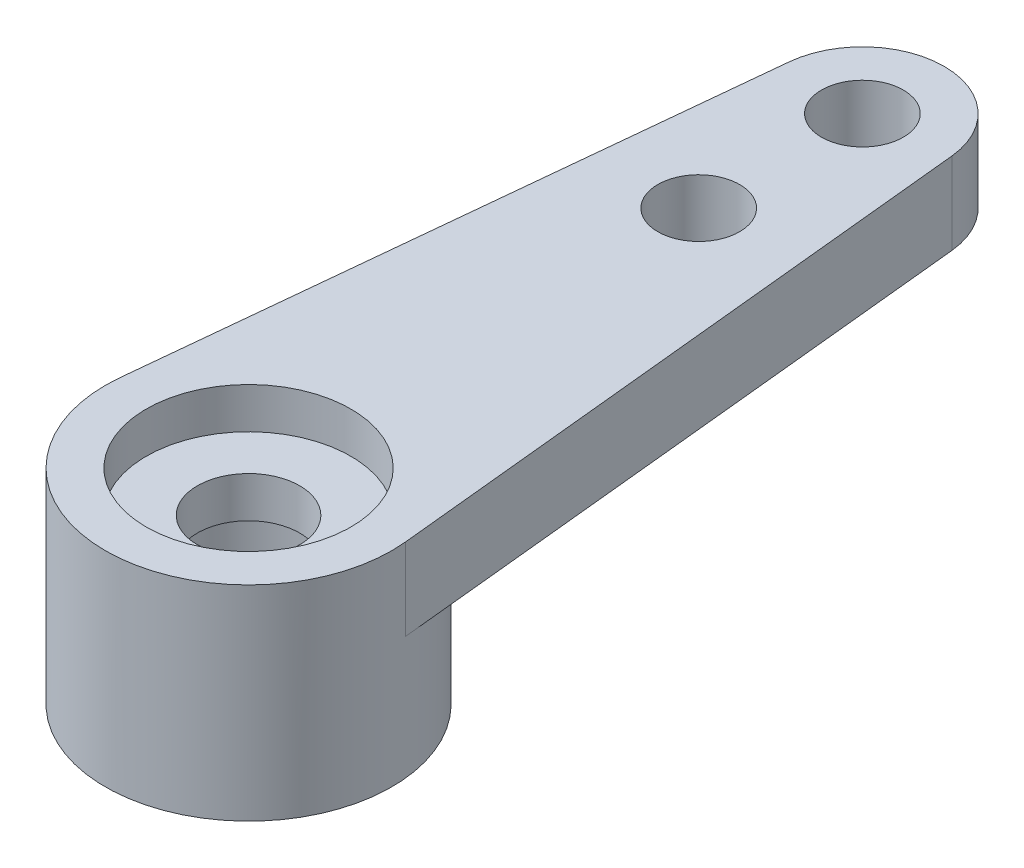
ISO-10303-21;
HEADER;
FILE_DESCRIPTION(('STEP AP214'),'2;1');
FILE_NAME('part.step','',(''),(''),'','','');
FILE_SCHEMA(('AUTOMOTIVE_DESIGN { 1 0 10303 214 1 1 1 1 }'));
ENDSEC;
DATA;
#1=APPLICATION_CONTEXT('core data for automotive mechanical design processes');
#2=APPLICATION_PROTOCOL_DEFINITION('international standard','automotive_design',2000,#1);
#3=PRODUCT_CONTEXT('',#1,'mechanical');
#4=PRODUCT('Part','Part','',(#3));
#5=PRODUCT_RELATED_PRODUCT_CATEGORY('part','',(#4));
#6=PRODUCT_DEFINITION_FORMATION('','',#4);
#7=PRODUCT_DEFINITION_CONTEXT('part definition',#1,'design');
#8=PRODUCT_DEFINITION('design','',#6,#7);
#9=PRODUCT_DEFINITION_SHAPE('','',#8);
#10=(LENGTH_UNIT() NAMED_UNIT(*) SI_UNIT(.MILLI.,.METRE.));
#11=(NAMED_UNIT(*) PLANE_ANGLE_UNIT() SI_UNIT($,.RADIAN.));
#12=(NAMED_UNIT(*) SI_UNIT($,.STERADIAN.) SOLID_ANGLE_UNIT());
#13=UNCERTAINTY_MEASURE_WITH_UNIT(LENGTH_MEASURE(1.E-05),#10,'distance_accuracy_value','');
#14=(GEOMETRIC_REPRESENTATION_CONTEXT(3) GLOBAL_UNCERTAINTY_ASSIGNED_CONTEXT((#13)) GLOBAL_UNIT_ASSIGNED_CONTEXT((#10,
#11,#12)) REPRESENTATION_CONTEXT('',''));
#15=CARTESIAN_POINT('',(0.,0.,0.));
#16=DIRECTION('',(0.,0.,1.));
#17=DIRECTION('',(1.,0.,0.));
#18=AXIS2_PLACEMENT_3D('',#15,#16,#17);
#19=CARTESIAN_POINT('',(0.,2.,0.));
#20=DIRECTION('',(0.,-1.,0.));
#21=DIRECTION('',(0.,0.,-1.));
#22=AXIS2_PLACEMENT_3D('',#19,#20,#21);
#23=CYLINDRICAL_SURFACE('',#22,1.25);
#24=CARTESIAN_POINT('',(0.,0.,0.));
#25=DIRECTION('',(0.,1.,0.));
#26=DIRECTION('',(0.,0.,1.));
#27=AXIS2_PLACEMENT_3D('',#24,#25,#26);
#28=CIRCLE('',#27,1.25);
#29=CARTESIAN_POINT('',(0.,0.,1.25));
#30=VERTEX_POINT('',#29);
#31=EDGE_CURVE('E130',#30,#30,#28,.T.);
#32=ORIENTED_EDGE('',*,*,#31,.F.);
#33=EDGE_LOOP('',(#32));
#34=FACE_BOUND('',#33,.T.);
#35=CARTESIAN_POINT('',(0.,1.,0.));
#36=DIRECTION('',(0.,1.,0.));
#37=DIRECTION('',(0.,0.,1.));
#38=AXIS2_PLACEMENT_3D('',#35,#36,#37);
#39=CIRCLE('',#38,1.25);
#40=CARTESIAN_POINT('',(0.,1.,1.25));
#41=VERTEX_POINT('',#40);
#42=EDGE_CURVE('E45',#41,#41,#39,.T.);
#43=ORIENTED_EDGE('',*,*,#42,.T.);
#44=EDGE_LOOP('',(#43));
#45=FACE_BOUND('',#44,.T.);
#46=ADVANCED_FACE('F41',(#34,#45),#23,.F.);
#47=CARTESIAN_POINT('',(0.,0.,0.));
#48=DIRECTION('',(0.,1.,0.));
#49=DIRECTION('',(0.,0.,1.));
#50=AXIS2_PLACEMENT_3D('',#47,#48,#49);
#51=PLANE('',#50);
#52=ORIENTED_EDGE('',*,*,#31,.T.);
#53=EDGE_LOOP('',(#52));
#54=FACE_BOUND('',#53,.T.);
#55=CARTESIAN_POINT('',(0.,0.,0.));
#56=DIRECTION('',(0.,-1.,0.));
#57=DIRECTION('',(0.,0.,-1.));
#58=AXIS2_PLACEMENT_3D('',#55,#56,#57);
#59=CIRCLE('',#58,2.);
#60=CARTESIAN_POINT('',(0.,0.,-2.));
#61=VERTEX_POINT('',#60);
#62=EDGE_CURVE('E139',#61,#61,#59,.T.);
#63=ORIENTED_EDGE('',*,*,#62,.T.);
#64=EDGE_LOOP('',(#63));
#65=FACE_BOUND('',#64,.T.);
#66=ADVANCED_FACE('F166',(#54,#65),#51,.F.);
#67=CARTESIAN_POINT('',(0.,2.,0.));
#68=DIRECTION('',(0.,1.,0.));
#69=DIRECTION('',(0.,0.,1.));
#70=AXIS2_PLACEMENT_3D('',#67,#68,#69);
#71=PLANE('',#70);
#72=CARTESIAN_POINT('',(0.,2.,0.));
#73=DIRECTION('',(0.,1.,0.));
#74=DIRECTION('',(0.,0.,1.));
#75=AXIS2_PLACEMENT_3D('',#72,#73,#74);
#76=CIRCLE('',#75,2.5);
#77=CARTESIAN_POINT('',(0.,2.,2.5));
#78=VERTEX_POINT('',#77);
#79=EDGE_CURVE('E144',#78,#78,#76,.T.);
#80=ORIENTED_EDGE('',*,*,#79,.F.);
#81=EDGE_LOOP('',(#80));
#82=FACE_BOUND('',#81,.T.);
#83=CARTESIAN_POINT('',(0.,2.,-11.));
#84=DIRECTION('',(0.,1.,0.));
#85=DIRECTION('',(0.,0.,1.));
#86=AXIS2_PLACEMENT_3D('',#83,#84,#85);
#87=CIRCLE('',#86,1.);
#88=CARTESIAN_POINT('',(0.,2.,-10.));
#89=VERTEX_POINT('',#88);
#90=EDGE_CURVE('E124',#89,#89,#87,.T.);
#91=ORIENTED_EDGE('',*,*,#90,.F.);
#92=EDGE_LOOP('',(#91));
#93=FACE_BOUND('',#92,.T.);
#94=CARTESIAN_POINT('',(0.,2.,0.));
#95=DIRECTION('',(0.,1.,0.));
#96=DIRECTION('',(0.,0.,1.));
#97=AXIS2_PLACEMENT_3D('',#94,#95,#96);
#98=CIRCLE('',#97,3.5);
#99=CARTESIAN_POINT('',(-3.48245602987317,2.,-0.349999999999999));
#100=VERTEX_POINT('',#99);
#101=CARTESIAN_POINT('',(3.48245602987317,2.,-0.35));
#102=VERTEX_POINT('',#101);
#103=EDGE_CURVE('E104',#100,#102,#98,.T.);
#104=ORIENTED_EDGE('',*,*,#103,.T.);
#105=DIRECTION('',(-0.1,0.,-0.99498743710662));
#106=VECTOR('',#105,1.);
#107=CARTESIAN_POINT('',(1.98997487421324,2.,-15.2));
#108=LINE('',#107,#106);
#109=CARTESIAN_POINT('',(1.98997487421324,2.,-15.2));
#110=VERTEX_POINT('',#109);
#111=EDGE_CURVE('E89',#102,#110,#108,.T.);
#112=ORIENTED_EDGE('',*,*,#111,.T.);
#113=CARTESIAN_POINT('',(0.,2.,-15.));
#114=DIRECTION('',(0.,1.,0.));
#115=DIRECTION('',(0.,0.,-1.));
#116=AXIS2_PLACEMENT_3D('',#113,#114,#115);
#117=CIRCLE('',#116,2.);
#118=CARTESIAN_POINT('',(-1.98997487421324,2.,-15.2));
#119=VERTEX_POINT('',#118);
#120=EDGE_CURVE('E109',#110,#119,#117,.T.);
#121=ORIENTED_EDGE('',*,*,#120,.T.);
#122=DIRECTION('',(-0.1,0.,0.99498743710662));
#123=VECTOR('',#122,1.);
#124=CARTESIAN_POINT('',(-3.48245602987317,2.,-0.349999999999999));
#125=LINE('',#124,#123);
#126=EDGE_CURVE('E60',#119,#100,#125,.T.);
#127=ORIENTED_EDGE('',*,*,#126,.T.);
#128=EDGE_LOOP('',(#104,#112,#121,#127));
#129=FACE_BOUND('',#128,.T.);
#130=CARTESIAN_POINT('',(0.,2.,-15.));
#131=DIRECTION('',(0.,1.,0.));
#132=DIRECTION('',(0.,0.,1.));
#133=AXIS2_PLACEMENT_3D('',#130,#131,#132);
#134=CIRCLE('',#133,1.);
#135=CARTESIAN_POINT('',(0.,2.,-14.));
#136=VERTEX_POINT('',#135);
#137=EDGE_CURVE('E99',#136,#136,#134,.T.);
#138=ORIENTED_EDGE('',*,*,#137,.F.);
#139=EDGE_LOOP('',(#138));
#140=FACE_BOUND('',#139,.T.);
#141=ADVANCED_FACE('F174',(#82,#93,#129,#140),#71,.T.);
#142=CARTESIAN_POINT('',(0.,0.,0.));
#143=DIRECTION('',(0.,-1.,0.));
#144=DIRECTION('',(0.,0.,-1.));
#145=AXIS2_PLACEMENT_3D('',#142,#143,#144);
#146=CIRCLE('',#145,3.5);
#147=CARTESIAN_POINT('',(-3.48245602987317,0.,-0.349999999999999));
#148=VERTEX_POINT('',#147);
#149=CARTESIAN_POINT('',(3.48245602987317,0.,-0.35));
#150=VERTEX_POINT('',#149);
#151=EDGE_CURVE('E11',#148,#150,#146,.T.);
#152=ORIENTED_EDGE('',*,*,#151,.F.);
#153=DIRECTION('',(-0.1,0.,0.99498743710662));
#154=VECTOR('',#153,1.);
#155=CARTESIAN_POINT('',(-3.48245602987317,0.,-0.349999999999999));
#156=LINE('',#155,#154);
#157=CARTESIAN_POINT('',(-1.98997487421324,0.,-15.2));
#158=VERTEX_POINT('',#157);
#159=EDGE_CURVE('E112',#158,#148,#156,.T.);
#160=ORIENTED_EDGE('',*,*,#159,.F.);
#161=CARTESIAN_POINT('',(0.,0.,-15.));
#162=DIRECTION('',(0.,1.,0.));
#163=DIRECTION('',(0.,0.,-1.));
#164=AXIS2_PLACEMENT_3D('',#161,#162,#163);
#165=CIRCLE('',#164,2.);
#166=CARTESIAN_POINT('',(1.98997487421324,0.,-15.2));
#167=VERTEX_POINT('',#166);
#168=EDGE_CURVE('E75',#167,#158,#165,.T.);
#169=ORIENTED_EDGE('',*,*,#168,.F.);
#170=DIRECTION('',(-0.1,0.,-0.99498743710662));
#171=VECTOR('',#170,1.);
#172=CARTESIAN_POINT('',(1.98997487421324,0.,-15.2));
#173=LINE('',#172,#171);
#174=EDGE_CURVE('E93',#150,#167,#173,.T.);
#175=ORIENTED_EDGE('',*,*,#174,.F.);
#176=EDGE_LOOP('',(#152,#160,#169,#175));
#177=FACE_BOUND('',#176,.T.);
#178=CARTESIAN_POINT('',(0.,0.,-15.));
#179=DIRECTION('',(0.,1.,0.));
#180=DIRECTION('',(0.,0.,1.));
#181=AXIS2_PLACEMENT_3D('',#178,#179,#180);
#182=CIRCLE('',#181,1.);
#183=CARTESIAN_POINT('',(0.,0.,-14.));
#184=VERTEX_POINT('',#183);
#185=EDGE_CURVE('E121',#184,#184,#182,.T.);
#186=ORIENTED_EDGE('',*,*,#185,.T.);
#187=EDGE_LOOP('',(#186));
#188=FACE_BOUND('',#187,.T.);
#189=CARTESIAN_POINT('',(0.,0.,-11.));
#190=DIRECTION('',(0.,1.,0.));
#191=DIRECTION('',(0.,0.,1.));
#192=AXIS2_PLACEMENT_3D('',#189,#190,#191);
#193=CIRCLE('',#192,1.);
#194=CARTESIAN_POINT('',(0.,0.,-10.));
#195=VERTEX_POINT('',#194);
#196=EDGE_CURVE('E127',#195,#195,#193,.T.);
#197=ORIENTED_EDGE('',*,*,#196,.T.);
#198=EDGE_LOOP('',(#197));
#199=FACE_BOUND('',#198,.T.);
#200=ADVANCED_FACE('F97',(#177,#188,#199),#51,.F.);
#201=CARTESIAN_POINT('',(0.,2.,0.));
#202=DIRECTION('',(0.,-1.,0.));
#203=DIRECTION('',(0.,0.,-1.));
#204=AXIS2_PLACEMENT_3D('',#201,#202,#203);
#205=CYLINDRICAL_SURFACE('',#204,3.5);
#206=DIRECTION('',(0.,-1.,0.));
#207=VECTOR('',#206,1.);
#208=CARTESIAN_POINT('',(-3.48245602987317,2.,-0.349999999999999));
#209=LINE('',#208,#207);
#210=EDGE_CURVE('E103',#100,#148,#209,.T.);
#211=ORIENTED_EDGE('',*,*,#210,.T.);
#212=ORIENTED_EDGE('',*,*,#151,.T.);
#213=DIRECTION('',(0.,-1.,0.));
#214=VECTOR('',#213,1.);
#215=CARTESIAN_POINT('',(3.48245602987317,2.,-0.35));
#216=LINE('',#215,#214);
#217=EDGE_CURVE('E51',#102,#150,#216,.T.);
#218=ORIENTED_EDGE('',*,*,#217,.F.);
#219=ORIENTED_EDGE('',*,*,#103,.F.);
#220=EDGE_LOOP('',(#211,#212,#218,#219));
#221=FACE_BOUND('',#220,.T.);
#222=CARTESIAN_POINT('',(0.,-3.,0.));
#223=DIRECTION('',(0.,-1.,0.));
#224=DIRECTION('',(0.,0.,-1.));
#225=AXIS2_PLACEMENT_3D('',#222,#223,#224);
#226=CIRCLE('',#225,3.5);
#227=CARTESIAN_POINT('',(0.,-3.,-3.5));
#228=VERTEX_POINT('',#227);
#229=EDGE_CURVE('E134',#228,#228,#226,.T.);
#230=ORIENTED_EDGE('',*,*,#229,.F.);
#231=EDGE_LOOP('',(#230));
#232=FACE_BOUND('',#231,.T.);
#233=ADVANCED_FACE('F43',(#221,#232),#205,.T.);
#234=CARTESIAN_POINT('',(1.98997487421324,2.,-15.2));
#235=DIRECTION('',(-0.99498743710662,0.,0.1));
#236=DIRECTION('',(0.1,0.,0.99498743710662));
#237=AXIS2_PLACEMENT_3D('',#234,#235,#236);
#238=PLANE('',#237);
#239=ORIENTED_EDGE('',*,*,#174,.T.);
#240=DIRECTION('',(0.,-1.,0.));
#241=VECTOR('',#240,1.);
#242=CARTESIAN_POINT('',(1.98997487421324,2.,-15.2));
#243=LINE('',#242,#241);
#244=EDGE_CURVE('E96',#110,#167,#243,.T.);
#245=ORIENTED_EDGE('',*,*,#244,.F.);
#246=ORIENTED_EDGE('',*,*,#111,.F.);
#247=ORIENTED_EDGE('',*,*,#217,.T.);
#248=EDGE_LOOP('',(#239,#245,#246,#247));
#249=FACE_BOUND('',#248,.T.);
#250=ADVANCED_FACE('F92',(#249),#238,.F.);
#251=CARTESIAN_POINT('',(0.,2.,-15.));
#252=DIRECTION('',(0.,-1.,0.));
#253=DIRECTION('',(0.,0.,-1.));
#254=AXIS2_PLACEMENT_3D('',#251,#252,#253);
#255=CYLINDRICAL_SURFACE('',#254,2.);
#256=ORIENTED_EDGE('',*,*,#168,.T.);
#257=DIRECTION('',(0.,-1.,0.));
#258=VECTOR('',#257,1.);
#259=CARTESIAN_POINT('',(-1.98997487421324,2.,-15.2));
#260=LINE('',#259,#258);
#261=EDGE_CURVE('E106',#119,#158,#260,.T.);
#262=ORIENTED_EDGE('',*,*,#261,.F.);
#263=ORIENTED_EDGE('',*,*,#120,.F.);
#264=ORIENTED_EDGE('',*,*,#244,.T.);
#265=EDGE_LOOP('',(#256,#262,#263,#264));
#266=FACE_BOUND('',#265,.T.);
#267=ADVANCED_FACE('F116',(#266),#255,.T.);
#268=CARTESIAN_POINT('',(-3.48245602987317,2.,-0.349999999999999));
#269=DIRECTION('',(0.99498743710662,0.,0.1));
#270=DIRECTION('',(0.1,0.,-0.99498743710662));
#271=AXIS2_PLACEMENT_3D('',#268,#269,#270);
#272=PLANE('',#271);
#273=ORIENTED_EDGE('',*,*,#159,.T.);
#274=ORIENTED_EDGE('',*,*,#210,.F.);
#275=ORIENTED_EDGE('',*,*,#126,.F.);
#276=ORIENTED_EDGE('',*,*,#261,.T.);
#277=EDGE_LOOP('',(#273,#274,#275,#276));
#278=FACE_BOUND('',#277,.T.);
#279=ADVANCED_FACE('F189',(#278),#272,.F.);
#280=CARTESIAN_POINT('',(0.,2.,-15.));
#281=DIRECTION('',(0.,-1.,0.));
#282=DIRECTION('',(0.,0.,-1.));
#283=AXIS2_PLACEMENT_3D('',#280,#281,#282);
#284=CYLINDRICAL_SURFACE('',#283,1.);
#285=ORIENTED_EDGE('',*,*,#137,.T.);
#286=EDGE_LOOP('',(#285));
#287=FACE_BOUND('',#286,.T.);
#288=ORIENTED_EDGE('',*,*,#185,.F.);
#289=EDGE_LOOP('',(#288));
#290=FACE_BOUND('',#289,.T.);
#291=ADVANCED_FACE('F185',(#287,#290),#284,.F.);
#292=CARTESIAN_POINT('',(0.,2.,-11.));
#293=DIRECTION('',(0.,-1.,0.));
#294=DIRECTION('',(0.,0.,-1.));
#295=AXIS2_PLACEMENT_3D('',#292,#293,#294);
#296=CYLINDRICAL_SURFACE('',#295,1.);
#297=ORIENTED_EDGE('',*,*,#90,.T.);
#298=EDGE_LOOP('',(#297));
#299=FACE_BOUND('',#298,.T.);
#300=ORIENTED_EDGE('',*,*,#196,.F.);
#301=EDGE_LOOP('',(#300));
#302=FACE_BOUND('',#301,.T.);
#303=ADVANCED_FACE('F182',(#299,#302),#296,.F.);
#304=CARTESIAN_POINT('',(0.,-3.,0.));
#305=DIRECTION('',(0.,-1.,0.));
#306=DIRECTION('',(0.,0.,-1.));
#307=AXIS2_PLACEMENT_3D('',#304,#305,#306);
#308=PLANE('',#307);
#309=ORIENTED_EDGE('',*,*,#229,.T.);
#310=EDGE_LOOP('',(#309));
#311=FACE_BOUND('',#310,.T.);
#312=CARTESIAN_POINT('',(0.,-3.,0.));
#313=DIRECTION('',(0.,-1.,0.));
#314=DIRECTION('',(0.,0.,-1.));
#315=AXIS2_PLACEMENT_3D('',#312,#313,#314);
#316=CIRCLE('',#315,2.);
#317=CARTESIAN_POINT('',(0.,-3.,-2.));
#318=VERTEX_POINT('',#317);
#319=EDGE_CURVE('E138',#318,#318,#316,.T.);
#320=ORIENTED_EDGE('',*,*,#319,.F.);
#321=EDGE_LOOP('',(#320));
#322=FACE_BOUND('',#321,.T.);
#323=ADVANCED_FACE('F180',(#311,#322),#308,.T.);
#324=CARTESIAN_POINT('',(0.,-3.,0.));
#325=DIRECTION('',(0.,1.,0.));
#326=DIRECTION('',(0.,0.,1.));
#327=AXIS2_PLACEMENT_3D('',#324,#325,#326);
#328=CYLINDRICAL_SURFACE('',#327,2.);
#329=ORIENTED_EDGE('',*,*,#319,.T.);
#330=EDGE_LOOP('',(#329));
#331=FACE_BOUND('',#330,.T.);
#332=ORIENTED_EDGE('',*,*,#62,.F.);
#333=EDGE_LOOP('',(#332));
#334=FACE_BOUND('',#333,.T.);
#335=ADVANCED_FACE('F162',(#331,#334),#328,.F.);
#336=CARTESIAN_POINT('',(0.,1.,0.));
#337=DIRECTION('',(0.,1.,0.));
#338=DIRECTION('',(0.,0.,1.));
#339=AXIS2_PLACEMENT_3D('',#336,#337,#338);
#340=CYLINDRICAL_SURFACE('',#339,2.5);
#341=CARTESIAN_POINT('',(0.,1.,0.));
#342=DIRECTION('',(0.,1.,0.));
#343=DIRECTION('',(0.,0.,1.));
#344=AXIS2_PLACEMENT_3D('',#341,#342,#343);
#345=CIRCLE('',#344,2.5);
#346=CARTESIAN_POINT('',(0.,1.,2.5));
#347=VERTEX_POINT('',#346);
#348=EDGE_CURVE('E147',#347,#347,#345,.T.);
#349=ORIENTED_EDGE('',*,*,#348,.F.);
#350=EDGE_LOOP('',(#349));
#351=FACE_BOUND('',#350,.T.);
#352=ORIENTED_EDGE('',*,*,#79,.T.);
#353=EDGE_LOOP('',(#352));
#354=FACE_BOUND('',#353,.T.);
#355=ADVANCED_FACE('F157',(#351,#354),#340,.F.);
#356=CARTESIAN_POINT('',(0.,1.,0.));
#357=DIRECTION('',(0.,1.,0.));
#358=DIRECTION('',(0.,0.,1.));
#359=AXIS2_PLACEMENT_3D('',#356,#357,#358);
#360=PLANE('',#359);
#361=ORIENTED_EDGE('',*,*,#42,.F.);
#362=EDGE_LOOP('',(#361));
#363=FACE_BOUND('',#362,.T.);
#364=ORIENTED_EDGE('',*,*,#348,.T.);
#365=EDGE_LOOP('',(#364));
#366=FACE_BOUND('',#365,.T.);
#367=ADVANCED_FACE('F155',(#363,#366),#360,.T.);
#368=CLOSED_SHELL('',(#46,#66,#141,#200,#233,#250,#267,#279,#291,#303,#323,#335,#355,#367));
#369=MANIFOLD_SOLID_BREP('B2',#368);
#370=ADVANCED_BREP_SHAPE_REPRESENTATION('',(#18,#369),#14);
#371=SHAPE_DEFINITION_REPRESENTATION(#9,#370);
ENDSEC;
END-ISO-10303-21;
